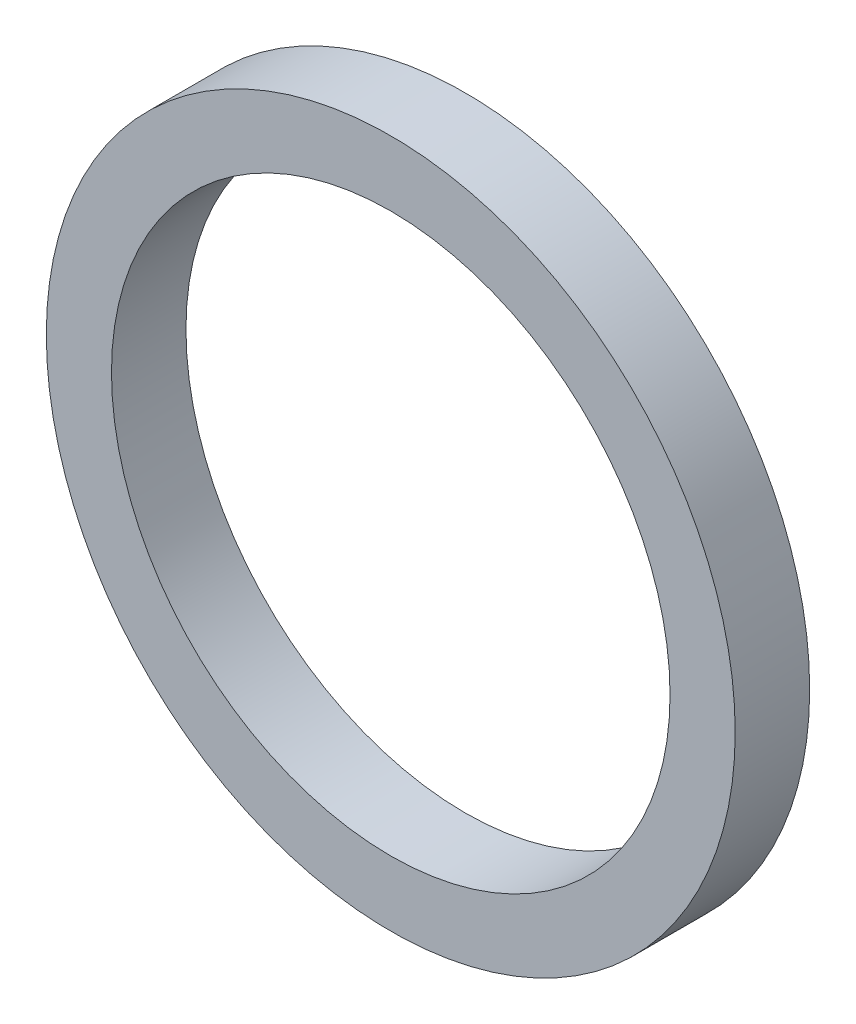
ISO-10303-21;
HEADER;
FILE_DESCRIPTION(('STEP AP214'),'2;1');
FILE_NAME('part.step','',(''),(''),'','','');
FILE_SCHEMA(('AUTOMOTIVE_DESIGN { 1 0 10303 214 1 1 1 1 }'));
ENDSEC;
DATA;
#1=APPLICATION_CONTEXT('core data for automotive mechanical design processes');
#2=APPLICATION_PROTOCOL_DEFINITION('international standard','automotive_design',2000,#1);
#3=PRODUCT_CONTEXT('',#1,'mechanical');
#4=PRODUCT('Part','Part','',(#3));
#5=PRODUCT_RELATED_PRODUCT_CATEGORY('part','',(#4));
#6=PRODUCT_DEFINITION_FORMATION('','',#4);
#7=PRODUCT_DEFINITION_CONTEXT('part definition',#1,'design');
#8=PRODUCT_DEFINITION('design','',#6,#7);
#9=PRODUCT_DEFINITION_SHAPE('','',#8);
#10=(LENGTH_UNIT() NAMED_UNIT(*) SI_UNIT(.MILLI.,.METRE.));
#11=(NAMED_UNIT(*) PLANE_ANGLE_UNIT() SI_UNIT($,.RADIAN.));
#12=(NAMED_UNIT(*) SI_UNIT($,.STERADIAN.) SOLID_ANGLE_UNIT());
#13=UNCERTAINTY_MEASURE_WITH_UNIT(LENGTH_MEASURE(1.E-05),#10,'distance_accuracy_value','');
#14=(GEOMETRIC_REPRESENTATION_CONTEXT(3) GLOBAL_UNCERTAINTY_ASSIGNED_CONTEXT((#13)) GLOBAL_UNIT_ASSIGNED_CONTEXT((#10,
#11,#12)) REPRESENTATION_CONTEXT('',''));
#15=CARTESIAN_POINT('',(0.,0.,0.));
#16=DIRECTION('',(0.,0.,1.));
#17=DIRECTION('',(1.,0.,0.));
#18=AXIS2_PLACEMENT_3D('',#15,#16,#17);
#19=CARTESIAN_POINT('',(0.,0.,4.));
#20=DIRECTION('',(0.,0.,1.));
#21=DIRECTION('',(1.,0.,0.));
#22=AXIS2_PLACEMENT_3D('',#19,#20,#21);
#23=PLANE('',#22);
#24=CARTESIAN_POINT('',(0.,0.,4.));
#25=DIRECTION('',(0.,0.,1.));
#26=DIRECTION('',(1.,0.,0.));
#27=AXIS2_PLACEMENT_3D('',#24,#25,#26);
#28=CIRCLE('',#27,18.5);
#29=CARTESIAN_POINT('',(18.5,0.,4.));
#30=VERTEX_POINT('',#29);
#31=EDGE_CURVE('E10',#30,#30,#28,.T.);
#32=ORIENTED_EDGE('',*,*,#31,.T.);
#33=EDGE_LOOP('',(#32));
#34=FACE_BOUND('',#33,.T.);
#35=CARTESIAN_POINT('',(0.,0.,4.));
#36=DIRECTION('',(0.,0.,1.));
#37=DIRECTION('',(1.,0.,0.));
#38=AXIS2_PLACEMENT_3D('',#35,#36,#37);
#39=CIRCLE('',#38,15.);
#40=CARTESIAN_POINT('',(15.,0.,4.));
#41=VERTEX_POINT('',#40);
#42=EDGE_CURVE('E49',#41,#41,#39,.T.);
#43=ORIENTED_EDGE('',*,*,#42,.F.);
#44=EDGE_LOOP('',(#43));
#45=FACE_BOUND('',#44,.T.);
#46=ADVANCED_FACE('F38',(#34,#45),#23,.T.);
#47=CARTESIAN_POINT('',(0.,0.,0.));
#48=DIRECTION('',(0.,0.,1.));
#49=DIRECTION('',(1.,0.,0.));
#50=AXIS2_PLACEMENT_3D('',#47,#48,#49);
#51=PLANE('',#50);
#52=CARTESIAN_POINT('',(0.,0.,0.));
#53=DIRECTION('',(0.,0.,1.));
#54=DIRECTION('',(1.,0.,0.));
#55=AXIS2_PLACEMENT_3D('',#52,#53,#54);
#56=CIRCLE('',#55,18.5);
#57=CARTESIAN_POINT('',(18.5,0.,0.));
#58=VERTEX_POINT('',#57);
#59=EDGE_CURVE('E42',#58,#58,#56,.T.);
#60=ORIENTED_EDGE('',*,*,#59,.F.);
#61=EDGE_LOOP('',(#60));
#62=FACE_BOUND('',#61,.T.);
#63=CARTESIAN_POINT('',(0.,0.,0.));
#64=DIRECTION('',(0.,0.,1.));
#65=DIRECTION('',(1.,0.,0.));
#66=AXIS2_PLACEMENT_3D('',#63,#64,#65);
#67=CIRCLE('',#66,15.);
#68=CARTESIAN_POINT('',(15.,0.,0.));
#69=VERTEX_POINT('',#68);
#70=EDGE_CURVE('E51',#69,#69,#67,.T.);
#71=ORIENTED_EDGE('',*,*,#70,.T.);
#72=EDGE_LOOP('',(#71));
#73=FACE_BOUND('',#72,.T.);
#74=ADVANCED_FACE('F61',(#62,#73),#51,.F.);
#75=CARTESIAN_POINT('',(0.,0.,4.));
#76=DIRECTION('',(0.,0.,-1.));
#77=DIRECTION('',(-1.,0.,0.));
#78=AXIS2_PLACEMENT_3D('',#75,#76,#77);
#79=CYLINDRICAL_SURFACE('',#78,18.5);
#80=ORIENTED_EDGE('',*,*,#31,.F.);
#81=EDGE_LOOP('',(#80));
#82=FACE_BOUND('',#81,.T.);
#83=ORIENTED_EDGE('',*,*,#59,.T.);
#84=EDGE_LOOP('',(#83));
#85=FACE_BOUND('',#84,.T.);
#86=ADVANCED_FACE('F40',(#82,#85),#79,.T.);
#87=CARTESIAN_POINT('',(0.,0.,4.));
#88=DIRECTION('',(0.,0.,-1.));
#89=DIRECTION('',(-1.,0.,0.));
#90=AXIS2_PLACEMENT_3D('',#87,#88,#89);
#91=CYLINDRICAL_SURFACE('',#90,15.);
#92=ORIENTED_EDGE('',*,*,#42,.T.);
#93=EDGE_LOOP('',(#92));
#94=FACE_BOUND('',#93,.T.);
#95=ORIENTED_EDGE('',*,*,#70,.F.);
#96=EDGE_LOOP('',(#95));
#97=FACE_BOUND('',#96,.T.);
#98=ADVANCED_FACE('F57',(#94,#97),#91,.F.);
#99=CLOSED_SHELL('',(#46,#74,#86,#98));
#100=MANIFOLD_SOLID_BREP('B2',#99);
#101=ADVANCED_BREP_SHAPE_REPRESENTATION('',(#18,#100),#14);
#102=SHAPE_DEFINITION_REPRESENTATION(#9,#101);
ENDSEC;
END-ISO-10303-21;
